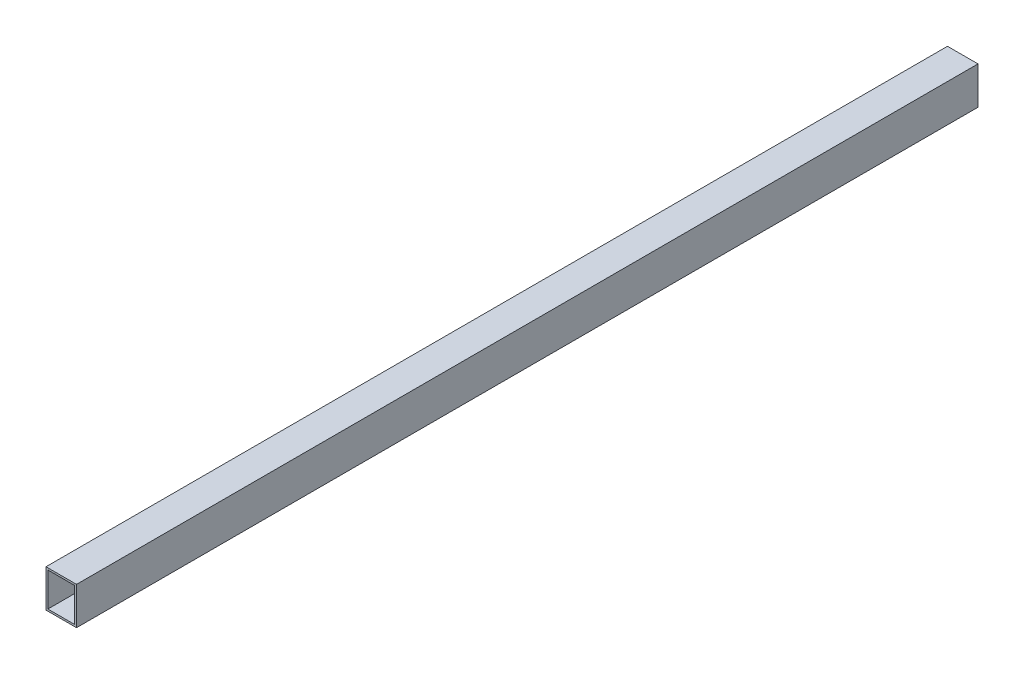
ISO-10303-21;
HEADER;
FILE_DESCRIPTION(('STEP AP214'),'2;1');
FILE_NAME('part.step','',(''),(''),'','','');
FILE_SCHEMA(('AUTOMOTIVE_DESIGN { 1 0 10303 214 1 1 1 1 }'));
ENDSEC;
DATA;
#1=APPLICATION_CONTEXT('core data for automotive mechanical design processes');
#2=APPLICATION_PROTOCOL_DEFINITION('international standard','automotive_design',2000,#1);
#3=PRODUCT_CONTEXT('',#1,'mechanical');
#4=PRODUCT('Part','Part','',(#3));
#5=PRODUCT_RELATED_PRODUCT_CATEGORY('part','',(#4));
#6=PRODUCT_DEFINITION_FORMATION('','',#4);
#7=PRODUCT_DEFINITION_CONTEXT('part definition',#1,'design');
#8=PRODUCT_DEFINITION('design','',#6,#7);
#9=PRODUCT_DEFINITION_SHAPE('','',#8);
#10=(LENGTH_UNIT() NAMED_UNIT(*) SI_UNIT(.MILLI.,.METRE.));
#11=(NAMED_UNIT(*) PLANE_ANGLE_UNIT() SI_UNIT($,.RADIAN.));
#12=(NAMED_UNIT(*) SI_UNIT($,.STERADIAN.) SOLID_ANGLE_UNIT());
#13=UNCERTAINTY_MEASURE_WITH_UNIT(LENGTH_MEASURE(1.E-05),#10,'distance_accuracy_value','');
#14=(GEOMETRIC_REPRESENTATION_CONTEXT(3) GLOBAL_UNCERTAINTY_ASSIGNED_CONTEXT((#13)) GLOBAL_UNIT_ASSIGNED_CONTEXT((#10,
#11,#12)) REPRESENTATION_CONTEXT('',''));
#15=CARTESIAN_POINT('',(0.,0.,0.));
#16=DIRECTION('',(0.,0.,1.));
#17=DIRECTION('',(1.,0.,0.));
#18=AXIS2_PLACEMENT_3D('',#15,#16,#17);
#19=CARTESIAN_POINT('',(-41.275,-52.,334.));
#20=DIRECTION('',(0.,0.,1.));
#21=DIRECTION('',(1.,0.,0.));
#22=AXIS2_PLACEMENT_3D('',#19,#20,#21);
#23=PLANE('',#22);
#24=DIRECTION('',(0.,-1.,0.));
#25=VECTOR('',#24,1.);
#26=CARTESIAN_POINT('',(0.,-52.,334.));
#27=LINE('',#26,#25);
#28=CARTESIAN_POINT('',(0.,-52.,334.));
#29=VERTEX_POINT('',#28);
#30=CARTESIAN_POINT('',(0.,-102.8,334.));
#31=VERTEX_POINT('',#30);
#32=EDGE_CURVE('E129',#29,#31,#27,.T.);
#33=ORIENTED_EDGE('',*,*,#32,.F.);
#34=DIRECTION('',(1.,0.,0.));
#35=VECTOR('',#34,1.);
#36=CARTESIAN_POINT('',(-41.275,-52.,334.));
#37=LINE('',#36,#35);
#38=CARTESIAN_POINT('',(-41.275,-52.,334.));
#39=VERTEX_POINT('',#38);
#40=EDGE_CURVE('E11',#39,#29,#37,.T.);
#41=ORIENTED_EDGE('',*,*,#40,.F.);
#42=DIRECTION('',(0.,-1.,0.));
#43=VECTOR('',#42,1.);
#44=CARTESIAN_POINT('',(-41.275,-52.,334.));
#45=LINE('',#44,#43);
#46=CARTESIAN_POINT('',(-41.275,-102.8,334.));
#47=VERTEX_POINT('',#46);
#48=EDGE_CURVE('E133',#39,#47,#45,.T.);
#49=ORIENTED_EDGE('',*,*,#48,.T.);
#50=DIRECTION('',(1.,0.,0.));
#51=VECTOR('',#50,1.);
#52=CARTESIAN_POINT('',(-41.275,-102.8,334.));
#53=LINE('',#52,#51);
#54=EDGE_CURVE('E36',#47,#31,#53,.T.);
#55=ORIENTED_EDGE('',*,*,#54,.T.);
#56=EDGE_LOOP('',(#33,#41,#49,#55));
#57=FACE_BOUND('',#56,.T.);
#58=DIRECTION('',(1.,0.,0.));
#59=VECTOR('',#58,1.);
#60=CARTESIAN_POINT('',(-41.275,-54.54,334.));
#61=LINE('',#60,#59);
#62=CARTESIAN_POINT('',(-38.735,-54.54,334.));
#63=VERTEX_POINT('',#62);
#64=CARTESIAN_POINT('',(-2.54,-54.54,334.));
#65=VERTEX_POINT('',#64);
#66=EDGE_CURVE('E106',#63,#65,#61,.T.);
#67=ORIENTED_EDGE('',*,*,#66,.T.);
#68=DIRECTION('',(0.,-1.,0.));
#69=VECTOR('',#68,1.);
#70=CARTESIAN_POINT('',(-2.54,0.,334.));
#71=LINE('',#70,#69);
#72=CARTESIAN_POINT('',(-2.54,-100.26,334.));
#73=VERTEX_POINT('',#72);
#74=EDGE_CURVE('E115',#65,#73,#71,.T.);
#75=ORIENTED_EDGE('',*,*,#74,.T.);
#76=DIRECTION('',(1.,0.,0.));
#77=VECTOR('',#76,1.);
#78=CARTESIAN_POINT('',(-41.275,-100.26,334.));
#79=LINE('',#78,#77);
#80=CARTESIAN_POINT('',(-38.735,-100.26,334.));
#81=VERTEX_POINT('',#80);
#82=EDGE_CURVE('E124',#81,#73,#79,.T.);
#83=ORIENTED_EDGE('',*,*,#82,.F.);
#84=DIRECTION('',(0.,-1.,0.));
#85=VECTOR('',#84,1.);
#86=CARTESIAN_POINT('',(-38.735,0.,334.));
#87=LINE('',#86,#85);
#88=EDGE_CURVE('E49',#63,#81,#87,.T.);
#89=ORIENTED_EDGE('',*,*,#88,.F.);
#90=EDGE_LOOP('',(#67,#75,#83,#89));
#91=FACE_BOUND('',#90,.T.);
#92=ADVANCED_FACE('F33',(#57,#91),#23,.T.);
#93=CARTESIAN_POINT('',(-41.275,-52.,-885.2));
#94=DIRECTION('',(0.,0.,-1.));
#95=DIRECTION('',(-1.,0.,0.));
#96=AXIS2_PLACEMENT_3D('',#93,#94,#95);
#97=PLANE('',#96);
#98=DIRECTION('',(0.,1.,0.));
#99=VECTOR('',#98,1.);
#100=CARTESIAN_POINT('',(0.,-52.,-885.2));
#101=LINE('',#100,#99);
#102=CARTESIAN_POINT('',(0.,-102.8,-885.2));
#103=VERTEX_POINT('',#102);
#104=CARTESIAN_POINT('',(0.,-52.,-885.2));
#105=VERTEX_POINT('',#104);
#106=EDGE_CURVE('E151',#103,#105,#101,.T.);
#107=ORIENTED_EDGE('',*,*,#106,.F.);
#108=DIRECTION('',(1.,0.,0.));
#109=VECTOR('',#108,1.);
#110=CARTESIAN_POINT('',(-41.275,-102.8,-885.2));
#111=LINE('',#110,#109);
#112=CARTESIAN_POINT('',(-41.275,-102.8,-885.2));
#113=VERTEX_POINT('',#112);
#114=EDGE_CURVE('E156',#113,#103,#111,.T.);
#115=ORIENTED_EDGE('',*,*,#114,.F.);
#116=DIRECTION('',(0.,1.,0.));
#117=VECTOR('',#116,1.);
#118=CARTESIAN_POINT('',(-41.275,-52.,-885.2));
#119=LINE('',#118,#117);
#120=CARTESIAN_POINT('',(-41.275,-52.,-885.2));
#121=VERTEX_POINT('',#120);
#122=EDGE_CURVE('E140',#113,#121,#119,.T.);
#123=ORIENTED_EDGE('',*,*,#122,.T.);
#124=DIRECTION('',(1.,0.,0.));
#125=VECTOR('',#124,1.);
#126=CARTESIAN_POINT('',(-41.275,-52.,-885.2));
#127=LINE('',#126,#125);
#128=EDGE_CURVE('E41',#121,#105,#127,.T.);
#129=ORIENTED_EDGE('',*,*,#128,.T.);
#130=EDGE_LOOP('',(#107,#115,#123,#129));
#131=FACE_BOUND('',#130,.T.);
#132=DIRECTION('',(1.,0.,0.));
#133=VECTOR('',#132,1.);
#134=CARTESIAN_POINT('',(-41.275,-100.26,-885.2));
#135=LINE('',#134,#133);
#136=CARTESIAN_POINT('',(-38.735,-100.26,-885.2));
#137=VERTEX_POINT('',#136);
#138=CARTESIAN_POINT('',(-2.54,-100.26,-885.2));
#139=VERTEX_POINT('',#138);
#140=EDGE_CURVE('E107',#137,#139,#135,.T.);
#141=ORIENTED_EDGE('',*,*,#140,.T.);
#142=DIRECTION('',(0.,1.,0.));
#143=VECTOR('',#142,1.);
#144=CARTESIAN_POINT('',(-2.54,0.,-885.2));
#145=LINE('',#144,#143);
#146=CARTESIAN_POINT('',(-2.54,-54.54,-885.2));
#147=VERTEX_POINT('',#146);
#148=EDGE_CURVE('E112',#139,#147,#145,.T.);
#149=ORIENTED_EDGE('',*,*,#148,.T.);
#150=DIRECTION('',(1.,0.,0.));
#151=VECTOR('',#150,1.);
#152=CARTESIAN_POINT('',(-41.275,-54.54,-885.2));
#153=LINE('',#152,#151);
#154=CARTESIAN_POINT('',(-38.735,-54.54,-885.2));
#155=VERTEX_POINT('',#154);
#156=EDGE_CURVE('E98',#155,#147,#153,.T.);
#157=ORIENTED_EDGE('',*,*,#156,.F.);
#158=DIRECTION('',(0.,1.,0.));
#159=VECTOR('',#158,1.);
#160=CARTESIAN_POINT('',(-38.735,0.,-885.2));
#161=LINE('',#160,#159);
#162=EDGE_CURVE('E125',#137,#155,#161,.T.);
#163=ORIENTED_EDGE('',*,*,#162,.F.);
#164=EDGE_LOOP('',(#141,#149,#157,#163));
#165=FACE_BOUND('',#164,.T.);
#166=ADVANCED_FACE('F118',(#131,#165),#97,.T.);
#167=CARTESIAN_POINT('',(-41.275,-52.,334.));
#168=DIRECTION('',(0.,1.,0.));
#169=DIRECTION('',(0.,0.,1.));
#170=AXIS2_PLACEMENT_3D('',#167,#168,#169);
#171=PLANE('',#170);
#172=DIRECTION('',(0.,0.,1.));
#173=VECTOR('',#172,1.);
#174=CARTESIAN_POINT('',(0.,-52.,334.));
#175=LINE('',#174,#173);
#176=EDGE_CURVE('E137',#105,#29,#175,.T.);
#177=ORIENTED_EDGE('',*,*,#176,.F.);
#178=ORIENTED_EDGE('',*,*,#128,.F.);
#179=DIRECTION('',(0.,0.,1.));
#180=VECTOR('',#179,1.);
#181=CARTESIAN_POINT('',(-41.275,-52.,334.));
#182=LINE('',#181,#180);
#183=EDGE_CURVE('E143',#121,#39,#182,.T.);
#184=ORIENTED_EDGE('',*,*,#183,.T.);
#185=ORIENTED_EDGE('',*,*,#40,.T.);
#186=EDGE_LOOP('',(#177,#178,#184,#185));
#187=FACE_BOUND('',#186,.T.);
#188=ADVANCED_FACE('F170',(#187),#171,.T.);
#189=CARTESIAN_POINT('',(-41.275,-102.8,334.));
#190=DIRECTION('',(0.,-1.,0.));
#191=DIRECTION('',(0.,0.,-1.));
#192=AXIS2_PLACEMENT_3D('',#189,#190,#191);
#193=PLANE('',#192);
#194=DIRECTION('',(0.,0.,-1.));
#195=VECTOR('',#194,1.);
#196=CARTESIAN_POINT('',(0.,-102.8,334.));
#197=LINE('',#196,#195);
#198=EDGE_CURVE('E148',#31,#103,#197,.T.);
#199=ORIENTED_EDGE('',*,*,#198,.F.);
#200=ORIENTED_EDGE('',*,*,#54,.F.);
#201=DIRECTION('',(0.,0.,-1.));
#202=VECTOR('',#201,1.);
#203=CARTESIAN_POINT('',(-41.275,-102.8,334.));
#204=LINE('',#203,#202);
#205=EDGE_CURVE('E136',#47,#113,#204,.T.);
#206=ORIENTED_EDGE('',*,*,#205,.T.);
#207=ORIENTED_EDGE('',*,*,#114,.T.);
#208=EDGE_LOOP('',(#199,#200,#206,#207));
#209=FACE_BOUND('',#208,.T.);
#210=ADVANCED_FACE('F165',(#209),#193,.T.);
#211=CARTESIAN_POINT('',(-41.275,0.,0.));
#212=DIRECTION('',(1.,0.,0.));
#213=DIRECTION('',(0.,0.,-1.));
#214=AXIS2_PLACEMENT_3D('',#211,#212,#213);
#215=PLANE('',#214);
#216=ORIENTED_EDGE('',*,*,#48,.F.);
#217=ORIENTED_EDGE('',*,*,#183,.F.);
#218=ORIENTED_EDGE('',*,*,#122,.F.);
#219=ORIENTED_EDGE('',*,*,#205,.F.);
#220=EDGE_LOOP('',(#216,#217,#218,#219));
#221=FACE_BOUND('',#220,.T.);
#222=ADVANCED_FACE('F173',(#221),#215,.F.);
#223=CARTESIAN_POINT('',(0.,0.,0.));
#224=DIRECTION('',(1.,0.,0.));
#225=DIRECTION('',(0.,0.,-1.));
#226=AXIS2_PLACEMENT_3D('',#223,#224,#225);
#227=PLANE('',#226);
#228=ORIENTED_EDGE('',*,*,#32,.T.);
#229=ORIENTED_EDGE('',*,*,#198,.T.);
#230=ORIENTED_EDGE('',*,*,#106,.T.);
#231=ORIENTED_EDGE('',*,*,#176,.T.);
#232=EDGE_LOOP('',(#228,#229,#230,#231));
#233=FACE_BOUND('',#232,.T.);
#234=ADVANCED_FACE('F167',(#233),#227,.T.);
#235=CARTESIAN_POINT('',(-41.275,-54.54,334.));
#236=DIRECTION('',(0.,1.,0.));
#237=DIRECTION('',(0.,0.,1.));
#238=AXIS2_PLACEMENT_3D('',#235,#236,#237);
#239=PLANE('',#238);
#240=DIRECTION('',(0.,0.,1.));
#241=VECTOR('',#240,1.);
#242=CARTESIAN_POINT('',(-2.54,-54.54,0.));
#243=LINE('',#242,#241);
#244=EDGE_CURVE('E101',#147,#65,#243,.T.);
#245=ORIENTED_EDGE('',*,*,#244,.T.);
#246=ORIENTED_EDGE('',*,*,#66,.F.);
#247=DIRECTION('',(0.,0.,1.));
#248=VECTOR('',#247,1.);
#249=CARTESIAN_POINT('',(-38.735,-54.54,0.));
#250=LINE('',#249,#248);
#251=EDGE_CURVE('E56',#155,#63,#250,.T.);
#252=ORIENTED_EDGE('',*,*,#251,.F.);
#253=ORIENTED_EDGE('',*,*,#156,.T.);
#254=EDGE_LOOP('',(#245,#246,#252,#253));
#255=FACE_BOUND('',#254,.T.);
#256=ADVANCED_FACE('F100',(#255),#239,.F.);
#257=CARTESIAN_POINT('',(-41.275,-100.26,334.));
#258=DIRECTION('',(0.,-1.,0.));
#259=DIRECTION('',(0.,0.,-1.));
#260=AXIS2_PLACEMENT_3D('',#257,#258,#259);
#261=PLANE('',#260);
#262=DIRECTION('',(0.,0.,-1.));
#263=VECTOR('',#262,1.);
#264=CARTESIAN_POINT('',(-2.54,-100.26,0.));
#265=LINE('',#264,#263);
#266=EDGE_CURVE('E119',#73,#139,#265,.T.);
#267=ORIENTED_EDGE('',*,*,#266,.T.);
#268=ORIENTED_EDGE('',*,*,#140,.F.);
#269=DIRECTION('',(0.,0.,-1.));
#270=VECTOR('',#269,1.);
#271=CARTESIAN_POINT('',(-38.735,-100.26,0.));
#272=LINE('',#271,#270);
#273=EDGE_CURVE('E127',#81,#137,#272,.T.);
#274=ORIENTED_EDGE('',*,*,#273,.F.);
#275=ORIENTED_EDGE('',*,*,#82,.T.);
#276=EDGE_LOOP('',(#267,#268,#274,#275));
#277=FACE_BOUND('',#276,.T.);
#278=ADVANCED_FACE('F198',(#277),#261,.F.);
#279=CARTESIAN_POINT('',(-38.735,0.,0.));
#280=DIRECTION('',(1.,0.,0.));
#281=DIRECTION('',(0.,0.,-1.));
#282=AXIS2_PLACEMENT_3D('',#279,#280,#281);
#283=PLANE('',#282);
#284=ORIENTED_EDGE('',*,*,#88,.T.);
#285=ORIENTED_EDGE('',*,*,#273,.T.);
#286=ORIENTED_EDGE('',*,*,#162,.T.);
#287=ORIENTED_EDGE('',*,*,#251,.T.);
#288=EDGE_LOOP('',(#284,#285,#286,#287));
#289=FACE_BOUND('',#288,.T.);
#290=ADVANCED_FACE('F195',(#289),#283,.T.);
#291=CARTESIAN_POINT('',(-2.54,0.,0.));
#292=DIRECTION('',(1.,0.,0.));
#293=DIRECTION('',(0.,0.,-1.));
#294=AXIS2_PLACEMENT_3D('',#291,#292,#293);
#295=PLANE('',#294);
#296=ORIENTED_EDGE('',*,*,#74,.F.);
#297=ORIENTED_EDGE('',*,*,#244,.F.);
#298=ORIENTED_EDGE('',*,*,#148,.F.);
#299=ORIENTED_EDGE('',*,*,#266,.F.);
#300=EDGE_LOOP('',(#296,#297,#298,#299));
#301=FACE_BOUND('',#300,.T.);
#302=ADVANCED_FACE('F110',(#301),#295,.F.);
#303=CLOSED_SHELL('',(#92,#166,#188,#210,#222,#234,#256,#278,#290,#302));
#304=MANIFOLD_SOLID_BREP('B2',#303);
#305=ADVANCED_BREP_SHAPE_REPRESENTATION('',(#18,#304),#14);
#306=SHAPE_DEFINITION_REPRESENTATION(#9,#305);
ENDSEC;
END-ISO-10303-21;
